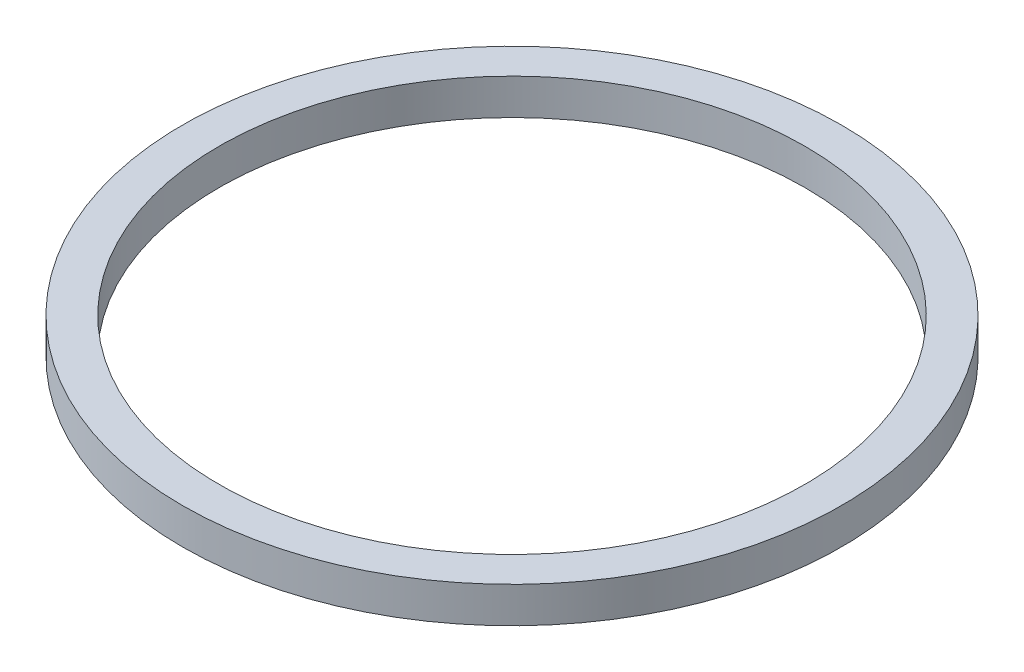
ISO-10303-21;
HEADER;
FILE_DESCRIPTION(('STEP AP214'),'2;1');
FILE_NAME('part.step','',(''),(''),'','','');
FILE_SCHEMA(('AUTOMOTIVE_DESIGN { 1 0 10303 214 1 1 1 1 }'));
ENDSEC;
DATA;
#1=APPLICATION_CONTEXT('core data for automotive mechanical design processes');
#2=APPLICATION_PROTOCOL_DEFINITION('international standard','automotive_design',2000,#1);
#3=PRODUCT_CONTEXT('',#1,'mechanical');
#4=PRODUCT('Part','Part','',(#3));
#5=PRODUCT_RELATED_PRODUCT_CATEGORY('part','',(#4));
#6=PRODUCT_DEFINITION_FORMATION('','',#4);
#7=PRODUCT_DEFINITION_CONTEXT('part definition',#1,'design');
#8=PRODUCT_DEFINITION('design','',#6,#7);
#9=PRODUCT_DEFINITION_SHAPE('','',#8);
#10=(LENGTH_UNIT() NAMED_UNIT(*) SI_UNIT(.MILLI.,.METRE.));
#11=(NAMED_UNIT(*) PLANE_ANGLE_UNIT() SI_UNIT($,.RADIAN.));
#12=(NAMED_UNIT(*) SI_UNIT($,.STERADIAN.) SOLID_ANGLE_UNIT());
#13=UNCERTAINTY_MEASURE_WITH_UNIT(LENGTH_MEASURE(1.E-05),#10,'distance_accuracy_value','');
#14=(GEOMETRIC_REPRESENTATION_CONTEXT(3) GLOBAL_UNCERTAINTY_ASSIGNED_CONTEXT((#13)) GLOBAL_UNIT_ASSIGNED_CONTEXT((#10,
#11,#12)) REPRESENTATION_CONTEXT('',''));
#15=CARTESIAN_POINT('',(0.,0.,0.));
#16=DIRECTION('',(0.,0.,1.));
#17=DIRECTION('',(1.,0.,0.));
#18=AXIS2_PLACEMENT_3D('',#15,#16,#17);
#19=CARTESIAN_POINT('',(-60.,8.13250000000001,0.));
#20=DIRECTION('',(0.,-1.,0.));
#21=DIRECTION('',(0.,0.,-1.));
#22=AXIS2_PLACEMENT_3D('',#19,#20,#21);
#23=PLANE('',#22);
#24=CARTESIAN_POINT('',(0.,8.13249999998789,0.));
#25=DIRECTION('',(0.,-1.,0.));
#26=DIRECTION('',(0.,0.,-1.));
#27=AXIS2_PLACEMENT_3D('',#24,#25,#26);
#28=CIRCLE('',#27,67.5);
#29=CARTESIAN_POINT('',(0.,8.13249999998789,-67.5));
#30=VERTEX_POINT('',#29);
#31=EDGE_CURVE('E10',#30,#30,#28,.T.);
#32=ORIENTED_EDGE('',*,*,#31,.F.);
#33=EDGE_LOOP('',(#32));
#34=FACE_BOUND('',#33,.T.);
#35=CARTESIAN_POINT('',(0.,8.13249999998789,0.));
#36=DIRECTION('',(0.,-1.,0.));
#37=DIRECTION('',(0.,0.,-1.));
#38=AXIS2_PLACEMENT_3D('',#35,#36,#37);
#39=CIRCLE('',#38,60.);
#40=CARTESIAN_POINT('',(0.,8.13249999998789,-60.));
#41=VERTEX_POINT('',#40);
#42=EDGE_CURVE('E53',#41,#41,#39,.T.);
#43=ORIENTED_EDGE('',*,*,#42,.T.);
#44=EDGE_LOOP('',(#43));
#45=FACE_BOUND('',#44,.T.);
#46=ADVANCED_FACE('F39',(#34,#45),#23,.F.);
#47=CARTESIAN_POINT('',(0.,-200069.047495165,0.));
#48=DIRECTION('',(0.,-1.,0.));
#49=DIRECTION('',(0.,0.,-1.));
#50=AXIS2_PLACEMENT_3D('',#47,#48,#49);
#51=CYLINDRICAL_SURFACE('',#50,67.5);
#52=CARTESIAN_POINT('',(0.,0.785000000007585,0.));
#53=DIRECTION('',(0.,-1.,0.));
#54=DIRECTION('',(0.,0.,-1.));
#55=AXIS2_PLACEMENT_3D('',#52,#53,#54);
#56=CIRCLE('',#55,67.5);
#57=CARTESIAN_POINT('',(0.,0.785000000007585,-67.5));
#58=VERTEX_POINT('',#57);
#59=EDGE_CURVE('E45',#58,#58,#56,.T.);
#60=ORIENTED_EDGE('',*,*,#59,.F.);
#61=EDGE_LOOP('',(#60));
#62=FACE_BOUND('',#61,.T.);
#63=ORIENTED_EDGE('',*,*,#31,.T.);
#64=EDGE_LOOP('',(#63));
#65=FACE_BOUND('',#64,.T.);
#66=ADVANCED_FACE('F68',(#62,#65),#51,.T.);
#67=CARTESIAN_POINT('',(-60.,0.785,0.));
#68=DIRECTION('',(0.,1.,0.));
#69=DIRECTION('',(0.,0.,1.));
#70=AXIS2_PLACEMENT_3D('',#67,#68,#69);
#71=PLANE('',#70);
#72=CARTESIAN_POINT('',(0.,0.785000000007585,0.));
#73=DIRECTION('',(0.,-1.,0.));
#74=DIRECTION('',(0.,0.,-1.));
#75=AXIS2_PLACEMENT_3D('',#72,#73,#74);
#76=CIRCLE('',#75,60.);
#77=CARTESIAN_POINT('',(0.,0.785000000007585,-60.));
#78=VERTEX_POINT('',#77);
#79=EDGE_CURVE('E49',#78,#78,#76,.T.);
#80=ORIENTED_EDGE('',*,*,#79,.F.);
#81=EDGE_LOOP('',(#80));
#82=FACE_BOUND('',#81,.T.);
#83=ORIENTED_EDGE('',*,*,#59,.T.);
#84=EDGE_LOOP('',(#83));
#85=FACE_BOUND('',#84,.T.);
#86=ADVANCED_FACE('F63',(#82,#85),#71,.F.);
#87=CARTESIAN_POINT('',(0.,-200069.047495165,0.));
#88=DIRECTION('',(0.,-1.,0.));
#89=DIRECTION('',(0.,0.,-1.));
#90=AXIS2_PLACEMENT_3D('',#87,#88,#89);
#91=CYLINDRICAL_SURFACE('',#90,60.);
#92=ORIENTED_EDGE('',*,*,#42,.F.);
#93=EDGE_LOOP('',(#92));
#94=FACE_BOUND('',#93,.T.);
#95=ORIENTED_EDGE('',*,*,#79,.T.);
#96=EDGE_LOOP('',(#95));
#97=FACE_BOUND('',#96,.T.);
#98=ADVANCED_FACE('F60',(#94,#97),#91,.F.);
#99=CLOSED_SHELL('',(#46,#66,#86,#98));
#100=MANIFOLD_SOLID_BREP('B2',#99);
#101=ADVANCED_BREP_SHAPE_REPRESENTATION('',(#18,#100),#14);
#102=SHAPE_DEFINITION_REPRESENTATION(#9,#101);
ENDSEC;
END-ISO-10303-21;
